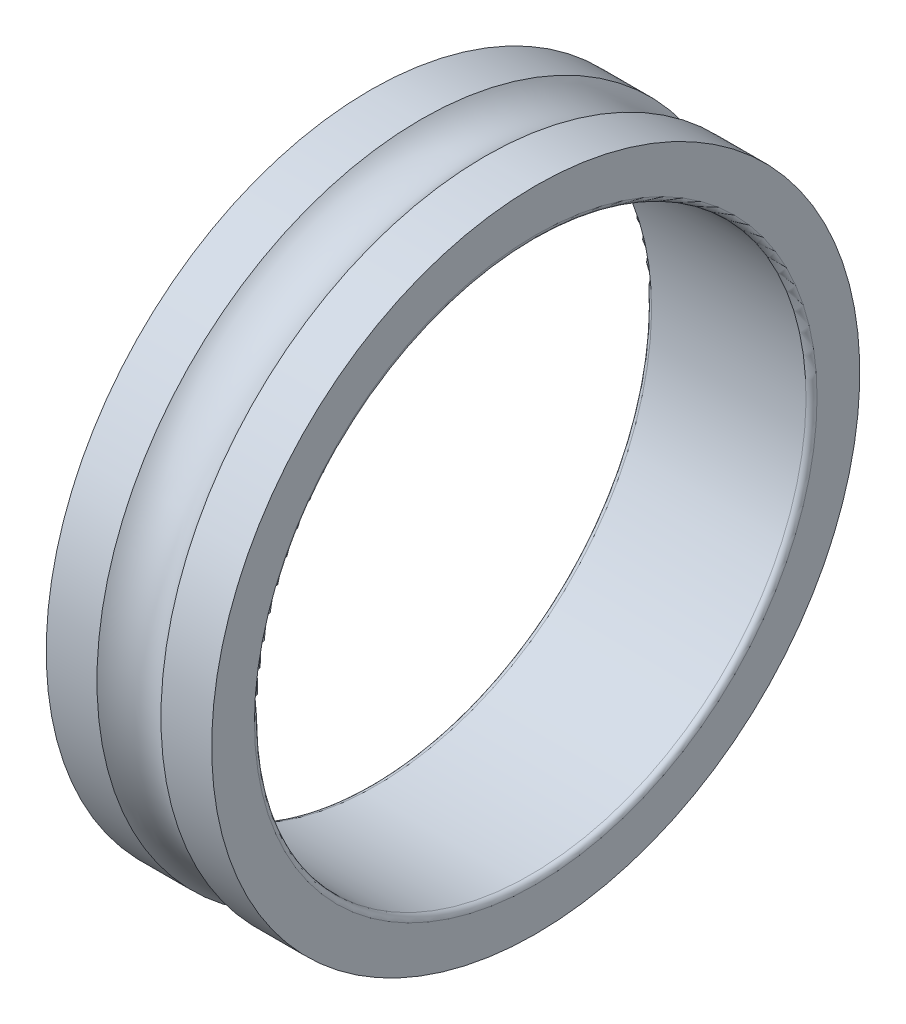
ISO-10303-21;
HEADER;
FILE_DESCRIPTION(('STEP AP214'),'2;1');
FILE_NAME('part.step','',(''),(''),'','','');
FILE_SCHEMA(('AUTOMOTIVE_DESIGN { 1 0 10303 214 1 1 1 1 }'));
ENDSEC;
DATA;
#1=APPLICATION_CONTEXT('core data for automotive mechanical design processes');
#2=APPLICATION_PROTOCOL_DEFINITION('international standard','automotive_design',2000,#1);
#3=PRODUCT_CONTEXT('',#1,'mechanical');
#4=PRODUCT('Part','Part','',(#3));
#5=PRODUCT_RELATED_PRODUCT_CATEGORY('part','',(#4));
#6=PRODUCT_DEFINITION_FORMATION('','',#4);
#7=PRODUCT_DEFINITION_CONTEXT('part definition',#1,'design');
#8=PRODUCT_DEFINITION('design','',#6,#7);
#9=PRODUCT_DEFINITION_SHAPE('','',#8);
#10=(LENGTH_UNIT() NAMED_UNIT(*) SI_UNIT(.MILLI.,.METRE.));
#11=(NAMED_UNIT(*) PLANE_ANGLE_UNIT() SI_UNIT($,.RADIAN.));
#12=(NAMED_UNIT(*) SI_UNIT($,.STERADIAN.) SOLID_ANGLE_UNIT());
#13=UNCERTAINTY_MEASURE_WITH_UNIT(LENGTH_MEASURE(1.E-05),#10,'distance_accuracy_value','');
#14=(GEOMETRIC_REPRESENTATION_CONTEXT(3) GLOBAL_UNCERTAINTY_ASSIGNED_CONTEXT((#13)) GLOBAL_UNIT_ASSIGNED_CONTEXT((#10,
#11,#12)) REPRESENTATION_CONTEXT('',''));
#15=CARTESIAN_POINT('',(0.,0.,0.));
#16=DIRECTION('',(0.,0.,1.));
#17=DIRECTION('',(1.,0.,0.));
#18=AXIS2_PLACEMENT_3D('',#15,#16,#17);
#19=CARTESIAN_POINT('',(7.6201344723662,0.,0.));
#20=DIRECTION('',(-1.,0.,0.));
#21=DIRECTION('',(0.,1.,0.));
#22=AXIS2_PLACEMENT_3D('',#19,#20,#21);
#23=CYLINDRICAL_SURFACE('',#22,17.625);
#24=CARTESIAN_POINT('',(6.24026894473239,0.,0.));
#25=DIRECTION('',(1.,0.,0.));
#26=DIRECTION('',(0.,1.,0.));
#27=AXIS2_PLACEMENT_3D('',#24,#25,#26);
#28=CIRCLE('',#27,17.625);
#29=CARTESIAN_POINT('',(6.24026894473239,17.625,0.));
#30=VERTEX_POINT('',#29);
#31=EDGE_CURVE('E11',#30,#30,#28,.T.);
#32=ORIENTED_EDGE('',*,*,#31,.T.);
#33=EDGE_LOOP('',(#32));
#34=FACE_BOUND('',#33,.T.);
#35=CARTESIAN_POINT('',(9.,0.,0.));
#36=DIRECTION('',(1.,0.,0.));
#37=DIRECTION('',(0.,1.,0.));
#38=AXIS2_PLACEMENT_3D('',#35,#36,#37);
#39=CIRCLE('',#38,17.625);
#40=CARTESIAN_POINT('',(9.,17.625,0.));
#41=VERTEX_POINT('',#40);
#42=EDGE_CURVE('E62',#41,#41,#39,.T.);
#43=ORIENTED_EDGE('',*,*,#42,.F.);
#44=EDGE_LOOP('',(#43));
#45=FACE_BOUND('',#44,.T.);
#46=ADVANCED_FACE('F16',(#34,#45),#23,.T.);
#47=CARTESIAN_POINT('',(4.5,0.,0.));
#48=DIRECTION('',(1.,0.,0.));
#49=DIRECTION('',(0.,0.,-1.));
#50=AXIS2_PLACEMENT_3D('',#47,#48,#49);
#51=TOROIDAL_SURFACE('',#50,19.25,2.381);
#52=CARTESIAN_POINT('',(2.7597310552676,0.,0.));
#53=DIRECTION('',(1.,0.,0.));
#54=DIRECTION('',(0.,1.,0.));
#55=AXIS2_PLACEMENT_3D('',#52,#53,#54);
#56=CIRCLE('',#55,17.625);
#57=CARTESIAN_POINT('',(2.7597310552676,17.625,0.));
#58=VERTEX_POINT('',#57);
#59=EDGE_CURVE('E20',#58,#58,#56,.T.);
#60=ORIENTED_EDGE('',*,*,#59,.T.);
#61=EDGE_LOOP('',(#60));
#62=FACE_BOUND('',#61,.T.);
#63=ORIENTED_EDGE('',*,*,#31,.F.);
#64=EDGE_LOOP('',(#63));
#65=FACE_BOUND('',#64,.T.);
#66=ADVANCED_FACE('F86',(#62,#65),#51,.F.);
#67=CARTESIAN_POINT('',(1.3798655276338,0.,0.));
#68=DIRECTION('',(-1.,0.,0.));
#69=DIRECTION('',(0.,1.,0.));
#70=AXIS2_PLACEMENT_3D('',#67,#68,#69);
#71=CYLINDRICAL_SURFACE('',#70,17.625);
#72=CARTESIAN_POINT('',(0.,0.,0.));
#73=DIRECTION('',(1.,0.,0.));
#74=DIRECTION('',(0.,1.,0.));
#75=AXIS2_PLACEMENT_3D('',#72,#73,#74);
#76=CIRCLE('',#75,17.625);
#77=CARTESIAN_POINT('',(0.,17.625,0.));
#78=VERTEX_POINT('',#77);
#79=EDGE_CURVE('E67',#78,#78,#76,.T.);
#80=ORIENTED_EDGE('',*,*,#79,.T.);
#81=EDGE_LOOP('',(#80));
#82=FACE_BOUND('',#81,.T.);
#83=ORIENTED_EDGE('',*,*,#59,.F.);
#84=EDGE_LOOP('',(#83));
#85=FACE_BOUND('',#84,.T.);
#86=ADVANCED_FACE('F91',(#82,#85),#71,.T.);
#87=CARTESIAN_POINT('',(0.,16.4625,0.));
#88=DIRECTION('',(-1.,0.,0.));
#89=DIRECTION('',(0.,-1.,0.));
#90=AXIS2_PLACEMENT_3D('',#87,#88,#89);
#91=PLANE('',#90);
#92=CARTESIAN_POINT('',(0.,0.,0.));
#93=DIRECTION('',(1.,0.,0.));
#94=DIRECTION('',(0.,1.,0.));
#95=AXIS2_PLACEMENT_3D('',#92,#93,#94);
#96=CIRCLE('',#95,15.3);
#97=CARTESIAN_POINT('',(0.,15.3,0.));
#98=VERTEX_POINT('',#97);
#99=EDGE_CURVE('E42',#98,#98,#96,.T.);
#100=ORIENTED_EDGE('',*,*,#99,.T.);
#101=EDGE_LOOP('',(#100));
#102=FACE_BOUND('',#101,.T.);
#103=ORIENTED_EDGE('',*,*,#79,.F.);
#104=EDGE_LOOP('',(#103));
#105=FACE_BOUND('',#104,.T.);
#106=ADVANCED_FACE('F95',(#102,#105),#91,.T.);
#107=CARTESIAN_POINT('',(0.3,0.,0.));
#108=DIRECTION('',(1.,0.,0.));
#109=DIRECTION('',(0.,0.,-1.));
#110=AXIS2_PLACEMENT_3D('',#107,#108,#109);
#111=TOROIDAL_SURFACE('',#110,15.3,0.3);
#112=CARTESIAN_POINT('',(0.3,0.,0.));
#113=DIRECTION('',(1.,0.,0.));
#114=DIRECTION('',(0.,1.,0.));
#115=AXIS2_PLACEMENT_3D('',#112,#113,#114);
#116=CIRCLE('',#115,15.);
#117=CARTESIAN_POINT('',(0.3,15.,0.));
#118=VERTEX_POINT('',#117);
#119=EDGE_CURVE('E47',#118,#118,#116,.T.);
#120=ORIENTED_EDGE('',*,*,#119,.T.);
#121=EDGE_LOOP('',(#120));
#122=FACE_BOUND('',#121,.T.);
#123=ORIENTED_EDGE('',*,*,#99,.F.);
#124=EDGE_LOOP('',(#123));
#125=FACE_BOUND('',#124,.T.);
#126=ADVANCED_FACE('F18',(#122,#125),#111,.T.);
#127=CARTESIAN_POINT('',(4.5,0.,0.));
#128=DIRECTION('',(-1.,0.,0.));
#129=DIRECTION('',(0.,1.,0.));
#130=AXIS2_PLACEMENT_3D('',#127,#128,#129);
#131=CYLINDRICAL_SURFACE('',#130,15.);
#132=CARTESIAN_POINT('',(8.7,0.,0.));
#133=DIRECTION('',(1.,0.,0.));
#134=DIRECTION('',(0.,1.,0.));
#135=AXIS2_PLACEMENT_3D('',#132,#133,#134);
#136=CIRCLE('',#135,15.);
#137=CARTESIAN_POINT('',(8.7,15.,0.));
#138=VERTEX_POINT('',#137);
#139=EDGE_CURVE('E64',#138,#138,#136,.T.);
#140=ORIENTED_EDGE('',*,*,#139,.T.);
#141=EDGE_LOOP('',(#140));
#142=FACE_BOUND('',#141,.T.);
#143=ORIENTED_EDGE('',*,*,#119,.F.);
#144=EDGE_LOOP('',(#143));
#145=FACE_BOUND('',#144,.T.);
#146=ADVANCED_FACE('F72',(#142,#145),#131,.F.);
#147=CARTESIAN_POINT('',(8.7,0.,0.));
#148=DIRECTION('',(1.,0.,0.));
#149=DIRECTION('',(0.,0.,-1.));
#150=AXIS2_PLACEMENT_3D('',#147,#148,#149);
#151=TOROIDAL_SURFACE('',#150,15.3,0.3);
#152=CARTESIAN_POINT('',(9.,0.,0.));
#153=DIRECTION('',(1.,0.,0.));
#154=DIRECTION('',(0.,1.,0.));
#155=AXIS2_PLACEMENT_3D('',#152,#153,#154);
#156=CIRCLE('',#155,15.3);
#157=CARTESIAN_POINT('',(9.,15.3,0.));
#158=VERTEX_POINT('',#157);
#159=EDGE_CURVE('E58',#158,#158,#156,.T.);
#160=ORIENTED_EDGE('',*,*,#159,.T.);
#161=EDGE_LOOP('',(#160));
#162=FACE_BOUND('',#161,.T.);
#163=ORIENTED_EDGE('',*,*,#139,.F.);
#164=EDGE_LOOP('',(#163));
#165=FACE_BOUND('',#164,.T.);
#166=ADVANCED_FACE('F59',(#162,#165),#151,.T.);
#167=CARTESIAN_POINT('',(9.,16.4625,0.));
#168=DIRECTION('',(1.,0.,0.));
#169=DIRECTION('',(0.,1.,0.));
#170=AXIS2_PLACEMENT_3D('',#167,#168,#169);
#171=PLANE('',#170);
#172=ORIENTED_EDGE('',*,*,#42,.T.);
#173=EDGE_LOOP('',(#172));
#174=FACE_BOUND('',#173,.T.);
#175=ORIENTED_EDGE('',*,*,#159,.F.);
#176=EDGE_LOOP('',(#175));
#177=FACE_BOUND('',#176,.T.);
#178=ADVANCED_FACE('F75',(#174,#177),#171,.T.);
#179=CLOSED_SHELL('',(#46,#66,#86,#106,#126,#146,#166,#178));
#180=MANIFOLD_SOLID_BREP('B1',#179);
#181=ADVANCED_BREP_SHAPE_REPRESENTATION('',(#18,#180),#14);
#182=SHAPE_DEFINITION_REPRESENTATION(#9,#181);
ENDSEC;
END-ISO-10303-21;
